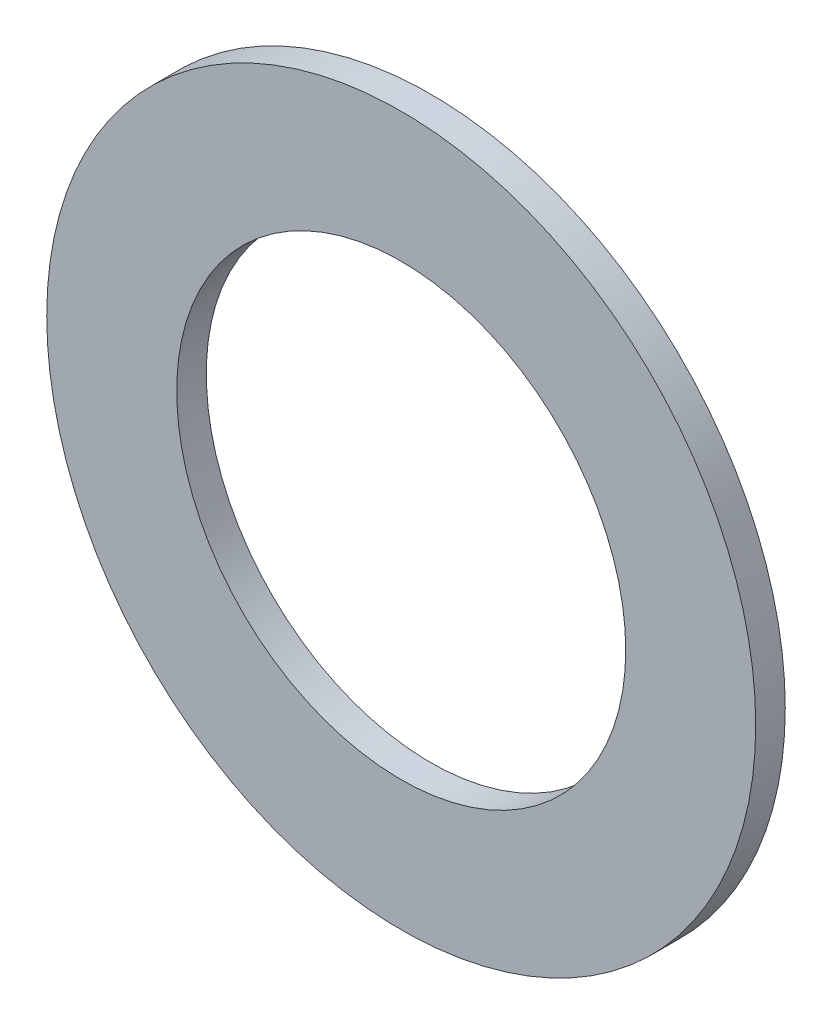
ISO-10303-21;
HEADER;
FILE_DESCRIPTION(('STEP AP214'),'2;1');
FILE_NAME('part.step','',(''),(''),'','','');
FILE_SCHEMA(('AUTOMOTIVE_DESIGN { 1 0 10303 214 1 1 1 1 }'));
ENDSEC;
DATA;
#1=APPLICATION_CONTEXT('core data for automotive mechanical design processes');
#2=APPLICATION_PROTOCOL_DEFINITION('international standard','automotive_design',2000,#1);
#3=PRODUCT_CONTEXT('',#1,'mechanical');
#4=PRODUCT('Part','Part','',(#3));
#5=PRODUCT_RELATED_PRODUCT_CATEGORY('part','',(#4));
#6=PRODUCT_DEFINITION_FORMATION('','',#4);
#7=PRODUCT_DEFINITION_CONTEXT('part definition',#1,'design');
#8=PRODUCT_DEFINITION('design','',#6,#7);
#9=PRODUCT_DEFINITION_SHAPE('','',#8);
#10=(LENGTH_UNIT() NAMED_UNIT(*) SI_UNIT(.MILLI.,.METRE.));
#11=(NAMED_UNIT(*) PLANE_ANGLE_UNIT() SI_UNIT($,.RADIAN.));
#12=(NAMED_UNIT(*) SI_UNIT($,.STERADIAN.) SOLID_ANGLE_UNIT());
#13=UNCERTAINTY_MEASURE_WITH_UNIT(LENGTH_MEASURE(1.E-05),#10,'distance_accuracy_value','');
#14=(GEOMETRIC_REPRESENTATION_CONTEXT(3) GLOBAL_UNCERTAINTY_ASSIGNED_CONTEXT((#13)) GLOBAL_UNIT_ASSIGNED_CONTEXT((#10,
#11,#12)) REPRESENTATION_CONTEXT('',''));
#15=CARTESIAN_POINT('',(0.,0.,0.));
#16=DIRECTION('',(0.,0.,1.));
#17=DIRECTION('',(1.,0.,0.));
#18=AXIS2_PLACEMENT_3D('',#15,#16,#17);
#19=CARTESIAN_POINT('',(0.,0.,1.));
#20=DIRECTION('',(0.,0.,1.));
#21=DIRECTION('',(1.,0.,0.));
#22=AXIS2_PLACEMENT_3D('',#19,#20,#21);
#23=PLANE('',#22);
#24=CARTESIAN_POINT('',(0.,0.,1.));
#25=DIRECTION('',(0.,0.,1.));
#26=DIRECTION('',(1.,0.,0.));
#27=AXIS2_PLACEMENT_3D('',#24,#25,#26);
#28=CIRCLE('',#27,12.);
#29=CARTESIAN_POINT('',(12.,0.,1.));
#30=VERTEX_POINT('',#29);
#31=EDGE_CURVE('E10',#30,#30,#28,.T.);
#32=ORIENTED_EDGE('',*,*,#31,.T.);
#33=EDGE_LOOP('',(#32));
#34=FACE_BOUND('',#33,.T.);
#35=CARTESIAN_POINT('',(0.,0.,1.));
#36=DIRECTION('',(0.,0.,1.));
#37=DIRECTION('',(1.,0.,0.));
#38=AXIS2_PLACEMENT_3D('',#35,#36,#37);
#39=CIRCLE('',#38,7.6);
#40=CARTESIAN_POINT('',(7.6,0.,1.));
#41=VERTEX_POINT('',#40);
#42=EDGE_CURVE('E41',#41,#41,#39,.T.);
#43=ORIENTED_EDGE('',*,*,#42,.F.);
#44=EDGE_LOOP('',(#43));
#45=FACE_BOUND('',#44,.T.);
#46=ADVANCED_FACE('F30',(#34,#45),#23,.T.);
#47=CARTESIAN_POINT('',(0.,0.,0.));
#48=DIRECTION('',(0.,0.,1.));
#49=DIRECTION('',(1.,0.,0.));
#50=AXIS2_PLACEMENT_3D('',#47,#48,#49);
#51=PLANE('',#50);
#52=CARTESIAN_POINT('',(0.,0.,0.));
#53=DIRECTION('',(0.,0.,1.));
#54=DIRECTION('',(1.,0.,0.));
#55=AXIS2_PLACEMENT_3D('',#52,#53,#54);
#56=CIRCLE('',#55,12.);
#57=CARTESIAN_POINT('',(12.,0.,0.));
#58=VERTEX_POINT('',#57);
#59=EDGE_CURVE('E34',#58,#58,#56,.T.);
#60=ORIENTED_EDGE('',*,*,#59,.F.);
#61=EDGE_LOOP('',(#60));
#62=FACE_BOUND('',#61,.T.);
#63=CARTESIAN_POINT('',(0.,0.,0.));
#64=DIRECTION('',(0.,0.,1.));
#65=DIRECTION('',(1.,0.,0.));
#66=AXIS2_PLACEMENT_3D('',#63,#64,#65);
#67=CIRCLE('',#66,7.6);
#68=CARTESIAN_POINT('',(7.6,0.,0.));
#69=VERTEX_POINT('',#68);
#70=EDGE_CURVE('E43',#69,#69,#67,.T.);
#71=ORIENTED_EDGE('',*,*,#70,.T.);
#72=EDGE_LOOP('',(#71));
#73=FACE_BOUND('',#72,.T.);
#74=ADVANCED_FACE('F53',(#62,#73),#51,.F.);
#75=CARTESIAN_POINT('',(0.,0.,1.));
#76=DIRECTION('',(0.,0.,-1.));
#77=DIRECTION('',(-1.,0.,0.));
#78=AXIS2_PLACEMENT_3D('',#75,#76,#77);
#79=CYLINDRICAL_SURFACE('',#78,12.);
#80=ORIENTED_EDGE('',*,*,#31,.F.);
#81=EDGE_LOOP('',(#80));
#82=FACE_BOUND('',#81,.T.);
#83=ORIENTED_EDGE('',*,*,#59,.T.);
#84=EDGE_LOOP('',(#83));
#85=FACE_BOUND('',#84,.T.);
#86=ADVANCED_FACE('F32',(#82,#85),#79,.T.);
#87=CARTESIAN_POINT('',(0.,0.,1.));
#88=DIRECTION('',(0.,0.,-1.));
#89=DIRECTION('',(-1.,0.,0.));
#90=AXIS2_PLACEMENT_3D('',#87,#88,#89);
#91=CYLINDRICAL_SURFACE('',#90,7.6);
#92=ORIENTED_EDGE('',*,*,#42,.T.);
#93=EDGE_LOOP('',(#92));
#94=FACE_BOUND('',#93,.T.);
#95=ORIENTED_EDGE('',*,*,#70,.F.);
#96=EDGE_LOOP('',(#95));
#97=FACE_BOUND('',#96,.T.);
#98=ADVANCED_FACE('F49',(#94,#97),#91,.F.);
#99=CLOSED_SHELL('',(#46,#74,#86,#98));
#100=MANIFOLD_SOLID_BREP('B2',#99);
#101=ADVANCED_BREP_SHAPE_REPRESENTATION('',(#18,#100),#14);
#102=SHAPE_DEFINITION_REPRESENTATION(#9,#101);
ENDSEC;
END-ISO-10303-21;
